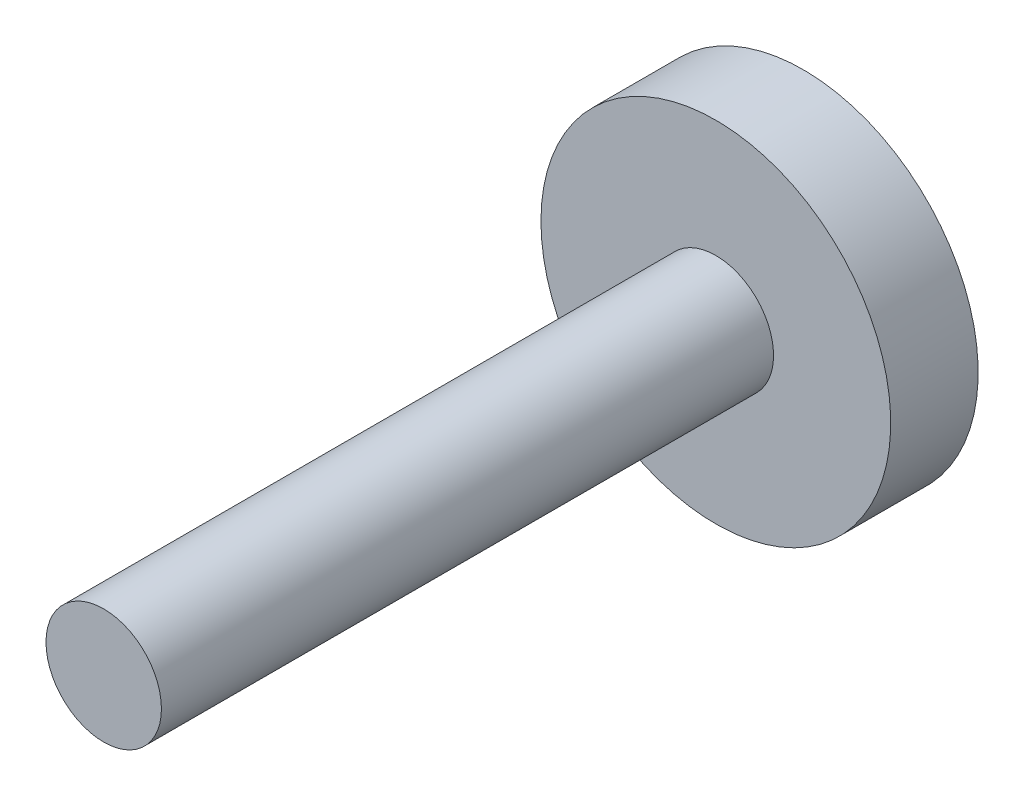
ISO-10303-21;
HEADER;
FILE_DESCRIPTION(('STEP AP214'),'2;1');
FILE_NAME('part.step','',(''),(''),'','','');
FILE_SCHEMA(('AUTOMOTIVE_DESIGN { 1 0 10303 214 1 1 1 1 }'));
ENDSEC;
DATA;
#1=APPLICATION_CONTEXT('core data for automotive mechanical design processes');
#2=APPLICATION_PROTOCOL_DEFINITION('international standard','automotive_design',2000,#1);
#3=PRODUCT_CONTEXT('',#1,'mechanical');
#4=PRODUCT('Part','Part','',(#3));
#5=PRODUCT_RELATED_PRODUCT_CATEGORY('part','',(#4));
#6=PRODUCT_DEFINITION_FORMATION('','',#4);
#7=PRODUCT_DEFINITION_CONTEXT('part definition',#1,'design');
#8=PRODUCT_DEFINITION('design','',#6,#7);
#9=PRODUCT_DEFINITION_SHAPE('','',#8);
#10=(LENGTH_UNIT() NAMED_UNIT(*) SI_UNIT(.MILLI.,.METRE.));
#11=(NAMED_UNIT(*) PLANE_ANGLE_UNIT() SI_UNIT($,.RADIAN.));
#12=(NAMED_UNIT(*) SI_UNIT($,.STERADIAN.) SOLID_ANGLE_UNIT());
#13=UNCERTAINTY_MEASURE_WITH_UNIT(LENGTH_MEASURE(1.E-05),#10,'distance_accuracy_value','');
#14=(GEOMETRIC_REPRESENTATION_CONTEXT(3) GLOBAL_UNCERTAINTY_ASSIGNED_CONTEXT((#13)) GLOBAL_UNIT_ASSIGNED_CONTEXT((#10,
#11,#12)) REPRESENTATION_CONTEXT('',''));
#15=CARTESIAN_POINT('',(0.,0.,0.));
#16=DIRECTION('',(0.,0.,1.));
#17=DIRECTION('',(1.,0.,0.));
#18=AXIS2_PLACEMENT_3D('',#15,#16,#17);
#19=CARTESIAN_POINT('',(0.,0.,20.));
#20=DIRECTION('',(0.,0.,-1.));
#21=DIRECTION('',(-1.,0.,0.));
#22=AXIS2_PLACEMENT_3D('',#19,#20,#21);
#23=CYLINDRICAL_SURFACE('',#22,1.65);
#24=CARTESIAN_POINT('',(0.,0.,20.));
#25=DIRECTION('',(0.,0.,1.));
#26=DIRECTION('',(1.,0.,0.));
#27=AXIS2_PLACEMENT_3D('',#24,#25,#26);
#28=CIRCLE('',#27,1.65);
#29=CARTESIAN_POINT('',(1.65,0.,20.));
#30=VERTEX_POINT('',#29);
#31=EDGE_CURVE('E50',#30,#30,#28,.T.);
#32=ORIENTED_EDGE('',*,*,#31,.F.);
#33=EDGE_LOOP('',(#32));
#34=FACE_BOUND('',#33,.T.);
#35=CARTESIAN_POINT('',(0.,0.,2.5));
#36=DIRECTION('',(0.,0.,-1.));
#37=DIRECTION('',(-1.,0.,0.));
#38=AXIS2_PLACEMENT_3D('',#35,#36,#37);
#39=CIRCLE('',#38,1.65);
#40=CARTESIAN_POINT('',(-1.65,0.,2.5));
#41=VERTEX_POINT('',#40);
#42=EDGE_CURVE('E10',#41,#41,#39,.T.);
#43=ORIENTED_EDGE('',*,*,#42,.F.);
#44=EDGE_LOOP('',(#43));
#45=FACE_BOUND('',#44,.T.);
#46=ADVANCED_FACE('F43',(#34,#45),#23,.T.);
#47=CARTESIAN_POINT('',(0.,0.,20.));
#48=DIRECTION('',(0.,0.,1.));
#49=DIRECTION('',(1.,0.,0.));
#50=AXIS2_PLACEMENT_3D('',#47,#48,#49);
#51=PLANE('',#50);
#52=ORIENTED_EDGE('',*,*,#31,.T.);
#53=EDGE_LOOP('',(#52));
#54=FACE_BOUND('',#53,.T.);
#55=ADVANCED_FACE('F72',(#54),#51,.T.);
#56=CARTESIAN_POINT('',(0.,0.,2.5));
#57=DIRECTION('',(0.,0.,-1.));
#58=DIRECTION('',(-1.,0.,0.));
#59=AXIS2_PLACEMENT_3D('',#56,#57,#58);
#60=CYLINDRICAL_SURFACE('',#59,5.);
#61=CARTESIAN_POINT('',(0.,0.,2.5));
#62=DIRECTION('',(0.,0.,-1.));
#63=DIRECTION('',(-1.,0.,0.));
#64=AXIS2_PLACEMENT_3D('',#61,#62,#63);
#65=CIRCLE('',#64,5.);
#66=CARTESIAN_POINT('',(-5.,0.,2.5));
#67=VERTEX_POINT('',#66);
#68=EDGE_CURVE('E55',#67,#67,#65,.T.);
#69=ORIENTED_EDGE('',*,*,#68,.T.);
#70=EDGE_LOOP('',(#69));
#71=FACE_BOUND('',#70,.T.);
#72=CARTESIAN_POINT('',(0.,0.,0.));
#73=DIRECTION('',(0.,0.,-1.));
#74=DIRECTION('',(-1.,0.,0.));
#75=AXIS2_PLACEMENT_3D('',#72,#73,#74);
#76=CIRCLE('',#75,5.);
#77=CARTESIAN_POINT('',(-5.,0.,0.));
#78=VERTEX_POINT('',#77);
#79=EDGE_CURVE('E60',#78,#78,#76,.T.);
#80=ORIENTED_EDGE('',*,*,#79,.F.);
#81=EDGE_LOOP('',(#80));
#82=FACE_BOUND('',#81,.T.);
#83=ADVANCED_FACE('F69',(#71,#82),#60,.T.);
#84=CARTESIAN_POINT('',(0.,0.,2.5));
#85=DIRECTION('',(0.,0.,-1.));
#86=DIRECTION('',(-1.,0.,0.));
#87=AXIS2_PLACEMENT_3D('',#84,#85,#86);
#88=PLANE('',#87);
#89=ORIENTED_EDGE('',*,*,#42,.T.);
#90=EDGE_LOOP('',(#89));
#91=FACE_BOUND('',#90,.T.);
#92=ORIENTED_EDGE('',*,*,#68,.F.);
#93=EDGE_LOOP('',(#92));
#94=FACE_BOUND('',#93,.T.);
#95=ADVANCED_FACE('F71',(#91,#94),#88,.F.);
#96=CARTESIAN_POINT('',(0.,0.,0.));
#97=DIRECTION('',(0.,0.,1.));
#98=DIRECTION('',(1.,0.,0.));
#99=AXIS2_PLACEMENT_3D('',#96,#97,#98);
#100=PLANE('',#99);
#101=ORIENTED_EDGE('',*,*,#79,.T.);
#102=EDGE_LOOP('',(#101));
#103=FACE_BOUND('',#102,.T.);
#104=ADVANCED_FACE('F67',(#103),#100,.F.);
#105=CLOSED_SHELL('',(#46,#55,#83,#95,#104));
#106=MANIFOLD_SOLID_BREP('B2',#105);
#107=ADVANCED_BREP_SHAPE_REPRESENTATION('',(#18,#106),#14);
#108=SHAPE_DEFINITION_REPRESENTATION(#9,#107);
ENDSEC;
END-ISO-10303-21;
